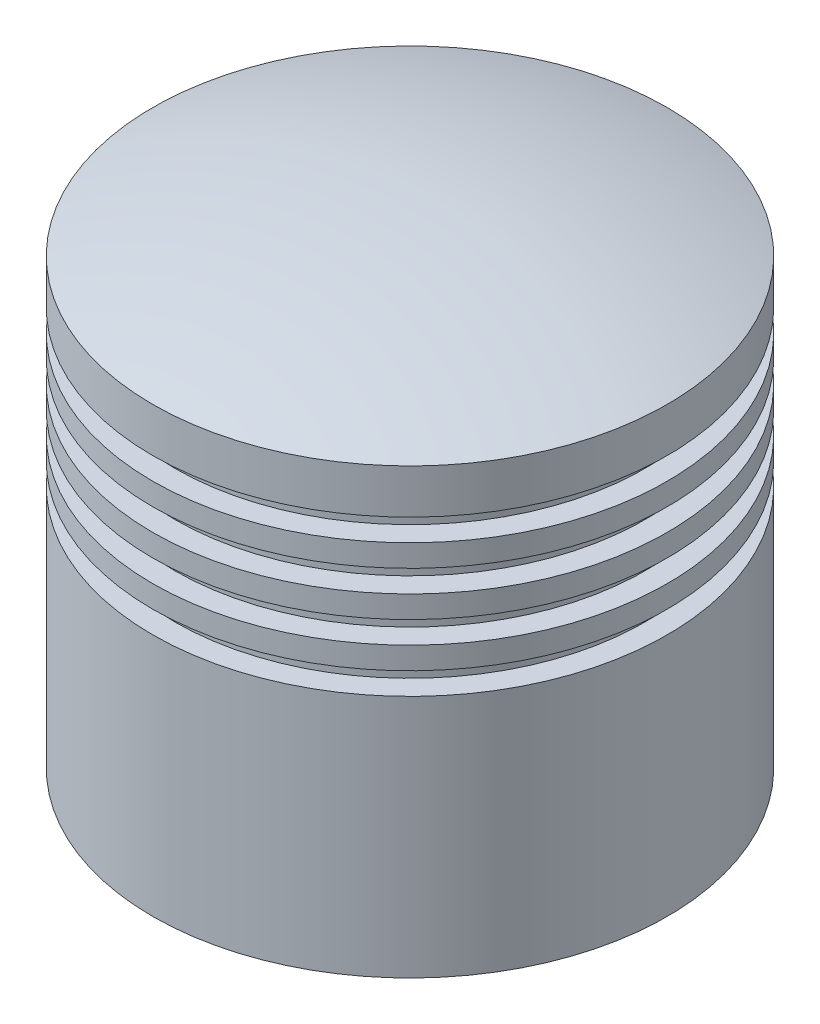
ISO-10303-21;
HEADER;
FILE_DESCRIPTION(('STEP AP214'),'2;1');
FILE_NAME('part.step','',(''),(''),'','','');
FILE_SCHEMA(('AUTOMOTIVE_DESIGN { 1 0 10303 214 1 1 1 1 }'));
ENDSEC;
DATA;
#1=APPLICATION_CONTEXT('core data for automotive mechanical design processes');
#2=APPLICATION_PROTOCOL_DEFINITION('international standard','automotive_design',2000,#1);
#3=PRODUCT_CONTEXT('',#1,'mechanical');
#4=PRODUCT('Part','Part','',(#3));
#5=PRODUCT_RELATED_PRODUCT_CATEGORY('part','',(#4));
#6=PRODUCT_DEFINITION_FORMATION('','',#4);
#7=PRODUCT_DEFINITION_CONTEXT('part definition',#1,'design');
#8=PRODUCT_DEFINITION('design','',#6,#7);
#9=PRODUCT_DEFINITION_SHAPE('','',#8);
#10=(LENGTH_UNIT() NAMED_UNIT(*) SI_UNIT(.MILLI.,.METRE.));
#11=(NAMED_UNIT(*) PLANE_ANGLE_UNIT() SI_UNIT($,.RADIAN.));
#12=(NAMED_UNIT(*) SI_UNIT($,.STERADIAN.) SOLID_ANGLE_UNIT());
#13=UNCERTAINTY_MEASURE_WITH_UNIT(LENGTH_MEASURE(1.E-05),#10,'distance_accuracy_value','');
#14=(GEOMETRIC_REPRESENTATION_CONTEXT(3) GLOBAL_UNCERTAINTY_ASSIGNED_CONTEXT((#13)) GLOBAL_UNIT_ASSIGNED_CONTEXT((#10,
#11,#12)) REPRESENTATION_CONTEXT('',''));
#15=CARTESIAN_POINT('',(0.,0.,0.));
#16=DIRECTION('',(0.,0.,1.));
#17=DIRECTION('',(1.,0.,0.));
#18=AXIS2_PLACEMENT_3D('',#15,#16,#17);
#19=CARTESIAN_POINT('',(0.,-59.9991042036009,-0.551878585586061));
#20=DIRECTION('',(-1.,0.,0.));
#21=DIRECTION('',(0.,0.,-1.));
#22=AXIS2_PLACEMENT_3D('',#19,#20,#21);
#23=CIRCLE('',#22,163.);
#24=TRIMMED_CURVE('',#23,(PARAMETER_VALUE(-1.5741820914574)),(PARAMETER_VALUE(1.5741820914574)),
.T.,.PARAMETER.);
#25=CARTESIAN_POINT('',(0.,-59.9991042036009,0.));
#26=DIRECTION('',(0.,-1.,0.));
#27=AXIS1_PLACEMENT('',#25,#26);
#28=SURFACE_OF_REVOLUTION('',#24,#27);
#29=CARTESIAN_POINT('',(0.,97.3767420638208,0.));
#30=DIRECTION('',(0.,-1.,0.));
#31=DIRECTION('',(0.,0.,-1.));
#32=AXIS2_PLACEMENT_3D('',#29,#30,#31);
#33=CIRCLE('',#32,43.);
#34=CARTESIAN_POINT('',(0.,97.3767420638208,-43.));
#35=VERTEX_POINT('',#34);
#36=EDGE_CURVE('E11',#35,#35,#33,.T.);
#37=ORIENTED_EDGE('',*,*,#36,.T.);
#38=EDGE_LOOP('',(#37));
#39=FACE_BOUND('',#38,.T.);
#40=CARTESIAN_POINT('',(0.,102.99996153,0.));
#41=VERTEX_POINT('',#40);
#42=VERTEX_LOOP('',#41);
#43=FACE_BOUND('',#42,.T.);
#44=ADVANCED_FACE('F37',(#39,#43),#28,.F.);
#45=CARTESIAN_POINT('',(0.,0.,0.));
#46=DIRECTION('',(0.,-1.,0.));
#47=DIRECTION('',(0.,0.,-1.));
#48=AXIS2_PLACEMENT_3D('',#45,#46,#47);
#49=CYLINDRICAL_SURFACE('',#48,43.);
#50=CARTESIAN_POINT('',(0.,30.,0.));
#51=DIRECTION('',(0.,-1.,0.));
#52=DIRECTION('',(0.,0.,-1.));
#53=AXIS2_PLACEMENT_3D('',#50,#51,#52);
#54=CIRCLE('',#53,43.);
#55=CARTESIAN_POINT('',(0.,30.,-43.));
#56=VERTEX_POINT('',#55);
#57=EDGE_CURVE('E44',#56,#56,#54,.T.);
#58=ORIENTED_EDGE('',*,*,#57,.T.);
#59=EDGE_LOOP('',(#58));
#60=FACE_BOUND('',#59,.T.);
#61=ORIENTED_EDGE('',*,*,#36,.F.);
#62=EDGE_LOOP('',(#61));
#63=FACE_BOUND('',#62,.T.);
#64=ADVANCED_FACE('F120',(#60,#63),#49,.F.);
#65=CARTESIAN_POINT('',(43.,30.,0.));
#66=DIRECTION('',(0.,-1.,0.));
#67=DIRECTION('',(0.,0.,-1.));
#68=AXIS2_PLACEMENT_3D('',#65,#66,#67);
#69=PLANE('',#68);
#70=CARTESIAN_POINT('',(0.,30.,0.));
#71=DIRECTION('',(0.,-1.,0.));
#72=DIRECTION('',(0.,0.,-1.));
#73=AXIS2_PLACEMENT_3D('',#70,#71,#72);
#74=CIRCLE('',#73,50.);
#75=CARTESIAN_POINT('',(0.,30.,-50.));
#76=VERTEX_POINT('',#75);
#77=EDGE_CURVE('E115',#76,#76,#74,.T.);
#78=ORIENTED_EDGE('',*,*,#77,.T.);
#79=EDGE_LOOP('',(#78));
#80=FACE_BOUND('',#79,.T.);
#81=ORIENTED_EDGE('',*,*,#57,.F.);
#82=EDGE_LOOP('',(#81));
#83=FACE_BOUND('',#82,.T.);
#84=ADVANCED_FACE('F123',(#80,#83),#69,.T.);
#85=CARTESIAN_POINT('',(0.,0.,0.));
#86=DIRECTION('',(0.,-1.,0.));
#87=DIRECTION('',(0.,0.,-1.));
#88=AXIS2_PLACEMENT_3D('',#85,#86,#87);
#89=CYLINDRICAL_SURFACE('',#88,50.);
#90=CARTESIAN_POINT('',(0.,0.,0.));
#91=DIRECTION('',(0.,-1.,0.));
#92=DIRECTION('',(0.,0.,-1.));
#93=AXIS2_PLACEMENT_3D('',#90,#91,#92);
#94=CIRCLE('',#93,50.);
#95=CARTESIAN_POINT('',(0.,0.,-50.));
#96=VERTEX_POINT('',#95);
#97=EDGE_CURVE('E112',#96,#96,#94,.T.);
#98=ORIENTED_EDGE('',*,*,#97,.T.);
#99=EDGE_LOOP('',(#98));
#100=FACE_BOUND('',#99,.T.);
#101=ORIENTED_EDGE('',*,*,#77,.F.);
#102=EDGE_LOOP('',(#101));
#103=FACE_BOUND('',#102,.T.);
#104=ADVANCED_FACE('F125',(#100,#103),#89,.F.);
#105=CARTESIAN_POINT('',(50.,0.,0.));
#106=DIRECTION('',(0.,-1.,0.));
#107=DIRECTION('',(0.,0.,-1.));
#108=AXIS2_PLACEMENT_3D('',#105,#106,#107);
#109=PLANE('',#108);
#110=CARTESIAN_POINT('',(0.,0.,0.));
#111=DIRECTION('',(0.,-1.,0.));
#112=DIRECTION('',(0.,0.,-1.));
#113=AXIS2_PLACEMENT_3D('',#110,#111,#112);
#114=CIRCLE('',#113,58.);
#115=CARTESIAN_POINT('',(0.,0.,-58.));
#116=VERTEX_POINT('',#115);
#117=EDGE_CURVE('E109',#116,#116,#114,.T.);
#118=ORIENTED_EDGE('',*,*,#117,.T.);
#119=EDGE_LOOP('',(#118));
#120=FACE_BOUND('',#119,.T.);
#121=ORIENTED_EDGE('',*,*,#97,.F.);
#122=EDGE_LOOP('',(#121));
#123=FACE_BOUND('',#122,.T.);
#124=ADVANCED_FACE('F132',(#120,#123),#109,.T.);
#125=CARTESIAN_POINT('',(0.,0.,0.));
#126=DIRECTION('',(0.,-1.,0.));
#127=DIRECTION('',(0.,0.,-1.));
#128=AXIS2_PLACEMENT_3D('',#125,#126,#127);
#129=CYLINDRICAL_SURFACE('',#128,58.);
#130=CARTESIAN_POINT('',(0.,55.,0.));
#131=DIRECTION('',(0.,-1.,0.));
#132=DIRECTION('',(0.,0.,-1.));
#133=AXIS2_PLACEMENT_3D('',#130,#131,#132);
#134=CIRCLE('',#133,58.);
#135=CARTESIAN_POINT('',(0.,55.,-58.));
#136=VERTEX_POINT('',#135);
#137=EDGE_CURVE('E106',#136,#136,#134,.T.);
#138=ORIENTED_EDGE('',*,*,#137,.T.);
#139=EDGE_LOOP('',(#138));
#140=FACE_BOUND('',#139,.T.);
#141=ORIENTED_EDGE('',*,*,#117,.F.);
#142=EDGE_LOOP('',(#141));
#143=FACE_BOUND('',#142,.T.);
#144=ADVANCED_FACE('F166',(#140,#143),#129,.T.);
#145=CARTESIAN_POINT('',(58.,55.,0.));
#146=DIRECTION('',(0.,1.,0.));
#147=DIRECTION('',(0.,0.,1.));
#148=AXIS2_PLACEMENT_3D('',#145,#146,#147);
#149=PLANE('',#148);
#150=CARTESIAN_POINT('',(0.,55.,0.));
#151=DIRECTION('',(0.,-1.,0.));
#152=DIRECTION('',(0.,0.,-1.));
#153=AXIS2_PLACEMENT_3D('',#150,#151,#152);
#154=CIRCLE('',#153,53.);
#155=CARTESIAN_POINT('',(0.,55.,-53.));
#156=VERTEX_POINT('',#155);
#157=EDGE_CURVE('E103',#156,#156,#154,.T.);
#158=ORIENTED_EDGE('',*,*,#157,.T.);
#159=EDGE_LOOP('',(#158));
#160=FACE_BOUND('',#159,.T.);
#161=ORIENTED_EDGE('',*,*,#137,.F.);
#162=EDGE_LOOP('',(#161));
#163=FACE_BOUND('',#162,.T.);
#164=ADVANCED_FACE('F177',(#160,#163),#149,.T.);
#165=CARTESIAN_POINT('',(0.,0.,0.));
#166=DIRECTION('',(0.,-1.,0.));
#167=DIRECTION('',(0.,0.,-1.));
#168=AXIS2_PLACEMENT_3D('',#165,#166,#167);
#169=CYLINDRICAL_SURFACE('',#168,53.);
#170=CARTESIAN_POINT('',(0.,60.,0.));
#171=DIRECTION('',(0.,-1.,0.));
#172=DIRECTION('',(0.,0.,-1.));
#173=AXIS2_PLACEMENT_3D('',#170,#171,#172);
#174=CIRCLE('',#173,53.);
#175=CARTESIAN_POINT('',(0.,60.,-53.));
#176=VERTEX_POINT('',#175);
#177=EDGE_CURVE('E100',#176,#176,#174,.T.);
#178=ORIENTED_EDGE('',*,*,#177,.T.);
#179=EDGE_LOOP('',(#178));
#180=FACE_BOUND('',#179,.T.);
#181=ORIENTED_EDGE('',*,*,#157,.F.);
#182=EDGE_LOOP('',(#181));
#183=FACE_BOUND('',#182,.T.);
#184=ADVANCED_FACE('F188',(#180,#183),#169,.T.);
#185=CARTESIAN_POINT('',(53.,60.,0.));
#186=DIRECTION('',(0.,-1.,0.));
#187=DIRECTION('',(0.,0.,-1.));
#188=AXIS2_PLACEMENT_3D('',#185,#186,#187);
#189=PLANE('',#188);
#190=CARTESIAN_POINT('',(0.,60.,0.));
#191=DIRECTION('',(0.,-1.,0.));
#192=DIRECTION('',(0.,0.,-1.));
#193=AXIS2_PLACEMENT_3D('',#190,#191,#192);
#194=CIRCLE('',#193,58.);
#195=CARTESIAN_POINT('',(0.,60.,-58.));
#196=VERTEX_POINT('',#195);
#197=EDGE_CURVE('E97',#196,#196,#194,.T.);
#198=ORIENTED_EDGE('',*,*,#197,.T.);
#199=EDGE_LOOP('',(#198));
#200=FACE_BOUND('',#199,.T.);
#201=ORIENTED_EDGE('',*,*,#177,.F.);
#202=EDGE_LOOP('',(#201));
#203=FACE_BOUND('',#202,.T.);
#204=ADVANCED_FACE('F199',(#200,#203),#189,.T.);
#205=CARTESIAN_POINT('',(0.,0.,0.));
#206=DIRECTION('',(0.,-1.,0.));
#207=DIRECTION('',(0.,0.,-1.));
#208=AXIS2_PLACEMENT_3D('',#205,#206,#207);
#209=CYLINDRICAL_SURFACE('',#208,58.);
#210=CARTESIAN_POINT('',(0.,65.,0.));
#211=DIRECTION('',(0.,-1.,0.));
#212=DIRECTION('',(0.,0.,-1.));
#213=AXIS2_PLACEMENT_3D('',#210,#211,#212);
#214=CIRCLE('',#213,58.);
#215=CARTESIAN_POINT('',(0.,65.,-58.));
#216=VERTEX_POINT('',#215);
#217=EDGE_CURVE('E94',#216,#216,#214,.T.);
#218=ORIENTED_EDGE('',*,*,#217,.T.);
#219=EDGE_LOOP('',(#218));
#220=FACE_BOUND('',#219,.T.);
#221=ORIENTED_EDGE('',*,*,#197,.F.);
#222=EDGE_LOOP('',(#221));
#223=FACE_BOUND('',#222,.T.);
#224=ADVANCED_FACE('F210',(#220,#223),#209,.T.);
#225=CARTESIAN_POINT('',(58.,65.,0.));
#226=DIRECTION('',(0.,1.,0.));
#227=DIRECTION('',(0.,0.,1.));
#228=AXIS2_PLACEMENT_3D('',#225,#226,#227);
#229=PLANE('',#228);
#230=CARTESIAN_POINT('',(0.,65.,0.));
#231=DIRECTION('',(0.,-1.,0.));
#232=DIRECTION('',(0.,0.,-1.));
#233=AXIS2_PLACEMENT_3D('',#230,#231,#232);
#234=CIRCLE('',#233,53.);
#235=CARTESIAN_POINT('',(0.,65.,-53.));
#236=VERTEX_POINT('',#235);
#237=EDGE_CURVE('E91',#236,#236,#234,.T.);
#238=ORIENTED_EDGE('',*,*,#237,.T.);
#239=EDGE_LOOP('',(#238));
#240=FACE_BOUND('',#239,.T.);
#241=ORIENTED_EDGE('',*,*,#217,.F.);
#242=EDGE_LOOP('',(#241));
#243=FACE_BOUND('',#242,.T.);
#244=ADVANCED_FACE('F221',(#240,#243),#229,.T.);
#245=CARTESIAN_POINT('',(0.,0.,0.));
#246=DIRECTION('',(0.,-1.,0.));
#247=DIRECTION('',(0.,0.,-1.));
#248=AXIS2_PLACEMENT_3D('',#245,#246,#247);
#249=CYLINDRICAL_SURFACE('',#248,53.);
#250=CARTESIAN_POINT('',(0.,70.,0.));
#251=DIRECTION('',(0.,-1.,0.));
#252=DIRECTION('',(0.,0.,-1.));
#253=AXIS2_PLACEMENT_3D('',#250,#251,#252);
#254=CIRCLE('',#253,53.);
#255=CARTESIAN_POINT('',(0.,70.,-53.));
#256=VERTEX_POINT('',#255);
#257=EDGE_CURVE('E88',#256,#256,#254,.T.);
#258=ORIENTED_EDGE('',*,*,#257,.T.);
#259=EDGE_LOOP('',(#258));
#260=FACE_BOUND('',#259,.T.);
#261=ORIENTED_EDGE('',*,*,#237,.F.);
#262=EDGE_LOOP('',(#261));
#263=FACE_BOUND('',#262,.T.);
#264=ADVANCED_FACE('F232',(#260,#263),#249,.T.);
#265=CARTESIAN_POINT('',(53.,70.,0.));
#266=DIRECTION('',(0.,-1.,0.));
#267=DIRECTION('',(0.,0.,-1.));
#268=AXIS2_PLACEMENT_3D('',#265,#266,#267);
#269=PLANE('',#268);
#270=CARTESIAN_POINT('',(0.,70.,0.));
#271=DIRECTION('',(0.,-1.,0.));
#272=DIRECTION('',(0.,0.,-1.));
#273=AXIS2_PLACEMENT_3D('',#270,#271,#272);
#274=CIRCLE('',#273,58.);
#275=CARTESIAN_POINT('',(0.,70.,-58.));
#276=VERTEX_POINT('',#275);
#277=EDGE_CURVE('E85',#276,#276,#274,.T.);
#278=ORIENTED_EDGE('',*,*,#277,.T.);
#279=EDGE_LOOP('',(#278));
#280=FACE_BOUND('',#279,.T.);
#281=ORIENTED_EDGE('',*,*,#257,.F.);
#282=EDGE_LOOP('',(#281));
#283=FACE_BOUND('',#282,.T.);
#284=ADVANCED_FACE('F243',(#280,#283),#269,.T.);
#285=CARTESIAN_POINT('',(0.,0.,0.));
#286=DIRECTION('',(0.,-1.,0.));
#287=DIRECTION('',(0.,0.,-1.));
#288=AXIS2_PLACEMENT_3D('',#285,#286,#287);
#289=CYLINDRICAL_SURFACE('',#288,58.);
#290=CARTESIAN_POINT('',(0.,75.,0.));
#291=DIRECTION('',(0.,-1.,0.));
#292=DIRECTION('',(0.,0.,-1.));
#293=AXIS2_PLACEMENT_3D('',#290,#291,#292);
#294=CIRCLE('',#293,58.);
#295=CARTESIAN_POINT('',(0.,75.,-58.));
#296=VERTEX_POINT('',#295);
#297=EDGE_CURVE('E82',#296,#296,#294,.T.);
#298=ORIENTED_EDGE('',*,*,#297,.T.);
#299=EDGE_LOOP('',(#298));
#300=FACE_BOUND('',#299,.T.);
#301=ORIENTED_EDGE('',*,*,#277,.F.);
#302=EDGE_LOOP('',(#301));
#303=FACE_BOUND('',#302,.T.);
#304=ADVANCED_FACE('F254',(#300,#303),#289,.T.);
#305=CARTESIAN_POINT('',(58.,75.,0.));
#306=DIRECTION('',(0.,1.,0.));
#307=DIRECTION('',(0.,0.,1.));
#308=AXIS2_PLACEMENT_3D('',#305,#306,#307);
#309=PLANE('',#308);
#310=CARTESIAN_POINT('',(0.,75.,0.));
#311=DIRECTION('',(0.,-1.,0.));
#312=DIRECTION('',(0.,0.,-1.));
#313=AXIS2_PLACEMENT_3D('',#310,#311,#312);
#314=CIRCLE('',#313,53.);
#315=CARTESIAN_POINT('',(0.,75.,-53.));
#316=VERTEX_POINT('',#315);
#317=EDGE_CURVE('E79',#316,#316,#314,.T.);
#318=ORIENTED_EDGE('',*,*,#317,.T.);
#319=EDGE_LOOP('',(#318));
#320=FACE_BOUND('',#319,.T.);
#321=ORIENTED_EDGE('',*,*,#297,.F.);
#322=EDGE_LOOP('',(#321));
#323=FACE_BOUND('',#322,.T.);
#324=ADVANCED_FACE('F265',(#320,#323),#309,.T.);
#325=CARTESIAN_POINT('',(0.,0.,0.));
#326=DIRECTION('',(0.,-1.,0.));
#327=DIRECTION('',(0.,0.,-1.));
#328=AXIS2_PLACEMENT_3D('',#325,#326,#327);
#329=CYLINDRICAL_SURFACE('',#328,53.);
#330=CARTESIAN_POINT('',(0.,80.,0.));
#331=DIRECTION('',(0.,-1.,0.));
#332=DIRECTION('',(0.,0.,-1.));
#333=AXIS2_PLACEMENT_3D('',#330,#331,#332);
#334=CIRCLE('',#333,53.);
#335=CARTESIAN_POINT('',(0.,80.,-53.));
#336=VERTEX_POINT('',#335);
#337=EDGE_CURVE('E76',#336,#336,#334,.T.);
#338=ORIENTED_EDGE('',*,*,#337,.T.);
#339=EDGE_LOOP('',(#338));
#340=FACE_BOUND('',#339,.T.);
#341=ORIENTED_EDGE('',*,*,#317,.F.);
#342=EDGE_LOOP('',(#341));
#343=FACE_BOUND('',#342,.T.);
#344=ADVANCED_FACE('F276',(#340,#343),#329,.T.);
#345=CARTESIAN_POINT('',(53.,80.,0.));
#346=DIRECTION('',(0.,-1.,0.));
#347=DIRECTION('',(0.,0.,-1.));
#348=AXIS2_PLACEMENT_3D('',#345,#346,#347);
#349=PLANE('',#348);
#350=CARTESIAN_POINT('',(0.,80.,0.));
#351=DIRECTION('',(0.,-1.,0.));
#352=DIRECTION('',(0.,0.,-1.));
#353=AXIS2_PLACEMENT_3D('',#350,#351,#352);
#354=CIRCLE('',#353,58.);
#355=CARTESIAN_POINT('',(0.,80.,-58.));
#356=VERTEX_POINT('',#355);
#357=EDGE_CURVE('E73',#356,#356,#354,.T.);
#358=ORIENTED_EDGE('',*,*,#357,.T.);
#359=EDGE_LOOP('',(#358));
#360=FACE_BOUND('',#359,.T.);
#361=ORIENTED_EDGE('',*,*,#337,.F.);
#362=EDGE_LOOP('',(#361));
#363=FACE_BOUND('',#362,.T.);
#364=ADVANCED_FACE('F287',(#360,#363),#349,.T.);
#365=CARTESIAN_POINT('',(0.,0.,0.));
#366=DIRECTION('',(0.,-1.,0.));
#367=DIRECTION('',(0.,0.,-1.));
#368=AXIS2_PLACEMENT_3D('',#365,#366,#367);
#369=CYLINDRICAL_SURFACE('',#368,58.);
#370=CARTESIAN_POINT('',(0.,85.,0.));
#371=DIRECTION('',(0.,-1.,0.));
#372=DIRECTION('',(0.,0.,-1.));
#373=AXIS2_PLACEMENT_3D('',#370,#371,#372);
#374=CIRCLE('',#373,58.);
#375=CARTESIAN_POINT('',(0.,85.,-58.));
#376=VERTEX_POINT('',#375);
#377=EDGE_CURVE('E70',#376,#376,#374,.T.);
#378=ORIENTED_EDGE('',*,*,#377,.T.);
#379=EDGE_LOOP('',(#378));
#380=FACE_BOUND('',#379,.T.);
#381=ORIENTED_EDGE('',*,*,#357,.F.);
#382=EDGE_LOOP('',(#381));
#383=FACE_BOUND('',#382,.T.);
#384=ADVANCED_FACE('F298',(#380,#383),#369,.T.);
#385=CARTESIAN_POINT('',(58.,85.,0.));
#386=DIRECTION('',(0.,1.,0.));
#387=DIRECTION('',(0.,0.,1.));
#388=AXIS2_PLACEMENT_3D('',#385,#386,#387);
#389=PLANE('',#388);
#390=CARTESIAN_POINT('',(0.,85.,0.));
#391=DIRECTION('',(0.,-1.,0.));
#392=DIRECTION('',(0.,0.,-1.));
#393=AXIS2_PLACEMENT_3D('',#390,#391,#392);
#394=CIRCLE('',#393,53.);
#395=CARTESIAN_POINT('',(0.,85.,-53.));
#396=VERTEX_POINT('',#395);
#397=EDGE_CURVE('E67',#396,#396,#394,.T.);
#398=ORIENTED_EDGE('',*,*,#397,.T.);
#399=EDGE_LOOP('',(#398));
#400=FACE_BOUND('',#399,.T.);
#401=ORIENTED_EDGE('',*,*,#377,.F.);
#402=EDGE_LOOP('',(#401));
#403=FACE_BOUND('',#402,.T.);
#404=ADVANCED_FACE('F309',(#400,#403),#389,.T.);
#405=CARTESIAN_POINT('',(0.,0.,0.));
#406=DIRECTION('',(0.,-1.,0.));
#407=DIRECTION('',(0.,0.,-1.));
#408=AXIS2_PLACEMENT_3D('',#405,#406,#407);
#409=CYLINDRICAL_SURFACE('',#408,53.);
#410=CARTESIAN_POINT('',(0.,90.,0.));
#411=DIRECTION('',(0.,-1.,0.));
#412=DIRECTION('',(0.,0.,-1.));
#413=AXIS2_PLACEMENT_3D('',#410,#411,#412);
#414=CIRCLE('',#413,53.);
#415=CARTESIAN_POINT('',(0.,90.,-53.));
#416=VERTEX_POINT('',#415);
#417=EDGE_CURVE('E62',#416,#416,#414,.T.);
#418=ORIENTED_EDGE('',*,*,#417,.T.);
#419=EDGE_LOOP('',(#418));
#420=FACE_BOUND('',#419,.T.);
#421=ORIENTED_EDGE('',*,*,#397,.F.);
#422=EDGE_LOOP('',(#421));
#423=FACE_BOUND('',#422,.T.);
#424=ADVANCED_FACE('F320',(#420,#423),#409,.T.);
#425=CARTESIAN_POINT('',(53.,90.,0.));
#426=DIRECTION('',(0.,-1.,0.));
#427=DIRECTION('',(0.,0.,-1.));
#428=AXIS2_PLACEMENT_3D('',#425,#426,#427);
#429=PLANE('',#428);
#430=CARTESIAN_POINT('',(0.,90.,0.));
#431=DIRECTION('',(0.,-1.,0.));
#432=DIRECTION('',(0.,0.,-1.));
#433=AXIS2_PLACEMENT_3D('',#430,#431,#432);
#434=CIRCLE('',#433,58.);
#435=CARTESIAN_POINT('',(0.,90.,-58.));
#436=VERTEX_POINT('',#435);
#437=EDGE_CURVE('E59',#436,#436,#434,.T.);
#438=ORIENTED_EDGE('',*,*,#437,.T.);
#439=EDGE_LOOP('',(#438));
#440=FACE_BOUND('',#439,.T.);
#441=ORIENTED_EDGE('',*,*,#417,.F.);
#442=EDGE_LOOP('',(#441));
#443=FACE_BOUND('',#442,.T.);
#444=ADVANCED_FACE('F331',(#440,#443),#429,.T.);
#445=CARTESIAN_POINT('',(0.,0.,0.));
#446=DIRECTION('',(0.,-1.,0.));
#447=DIRECTION('',(0.,0.,-1.));
#448=AXIS2_PLACEMENT_3D('',#445,#446,#447);
#449=CYLINDRICAL_SURFACE('',#448,58.);
#450=CARTESIAN_POINT('',(0.,100.,0.));
#451=DIRECTION('',(0.,-1.,0.));
#452=DIRECTION('',(0.,0.,-1.));
#453=AXIS2_PLACEMENT_3D('',#450,#451,#452);
#454=CIRCLE('',#453,58.);
#455=CARTESIAN_POINT('',(0.,100.,-58.));
#456=VERTEX_POINT('',#455);
#457=EDGE_CURVE('E57',#456,#456,#454,.T.);
#458=ORIENTED_EDGE('',*,*,#457,.T.);
#459=EDGE_LOOP('',(#458));
#460=FACE_BOUND('',#459,.T.);
#461=ORIENTED_EDGE('',*,*,#437,.F.);
#462=EDGE_LOOP('',(#461));
#463=FACE_BOUND('',#462,.T.);
#464=ADVANCED_FACE('F53',(#460,#463),#449,.T.);
#465=CARTESIAN_POINT('',(0.,-59.9991042036009,-0.551878585586061));
#466=DIRECTION('',(-1.,0.,0.));
#467=DIRECTION('',(0.,0.,-1.));
#468=AXIS2_PLACEMENT_3D('',#465,#466,#467);
#469=CIRCLE('',#468,170.);
#470=TRIMMED_CURVE('',#469,(PARAMETER_VALUE(-1.57404267711809)),
(PARAMETER_VALUE(1.57404267711809)),.T.,.PARAMETER.);
#471=CARTESIAN_POINT('',(0.,-59.9991042036009,0.));
#472=DIRECTION('',(0.,-1.,0.));
#473=AXIS1_PLACEMENT('',#471,#472);
#474=SURFACE_OF_REVOLUTION('',#470,#473);
#475=CARTESIAN_POINT('',(0.,110.,0.));
#476=VERTEX_POINT('',#475);
#477=VERTEX_LOOP('',#476);
#478=FACE_BOUND('',#477,.T.);
#479=ORIENTED_EDGE('',*,*,#457,.F.);
#480=EDGE_LOOP('',(#479));
#481=FACE_BOUND('',#480,.T.);
#482=ADVANCED_FACE('F50',(#478,#481),#474,.T.);
#483=CLOSED_SHELL('',(#44,#64,#84,#104,#124,#144,#164,#184,#204,#224,#244,#264,#284,#304,#324,
#344,#364,#384,#404,#424,#444,#464,#482));
#484=MANIFOLD_SOLID_BREP('B2',#483);
#485=ADVANCED_BREP_SHAPE_REPRESENTATION('',(#18,#484),#14);
#486=SHAPE_DEFINITION_REPRESENTATION(#9,#485);
ENDSEC;
END-ISO-10303-21;
